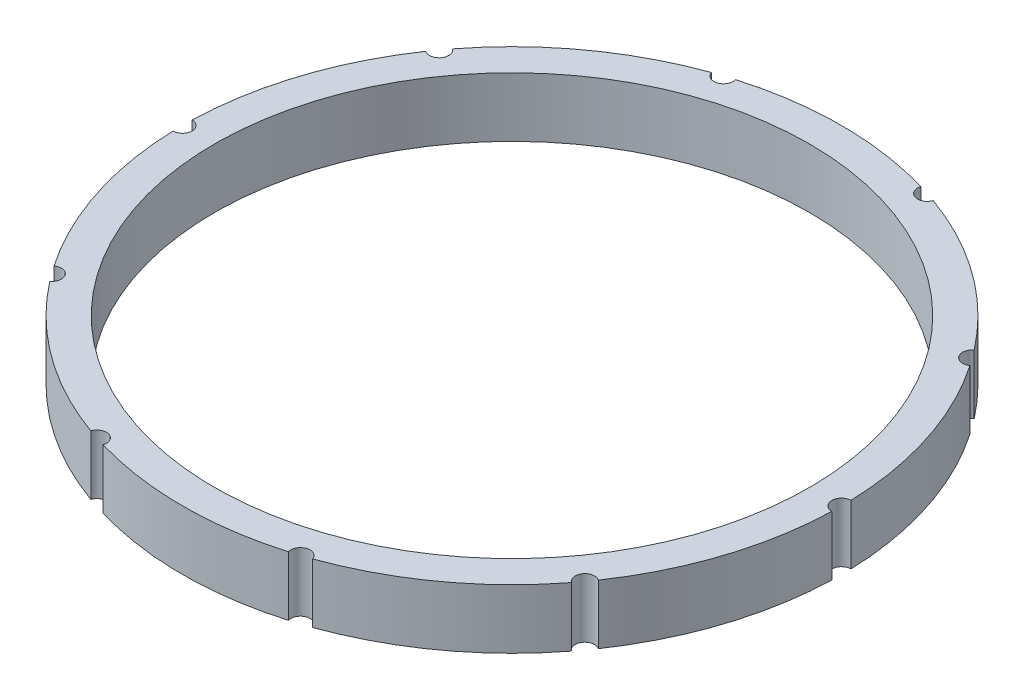
ISO-10303-21;
HEADER;
FILE_DESCRIPTION(('STEP AP214'),'2;1');
FILE_NAME('part.step','',(''),(''),'','','');
FILE_SCHEMA(('AUTOMOTIVE_DESIGN { 1 0 10303 214 1 1 1 1 }'));
ENDSEC;
DATA;
#1=APPLICATION_CONTEXT('core data for automotive mechanical design processes');
#2=APPLICATION_PROTOCOL_DEFINITION('international standard','automotive_design',2000,#1);
#3=PRODUCT_CONTEXT('',#1,'mechanical');
#4=PRODUCT('Part','Part','',(#3));
#5=PRODUCT_RELATED_PRODUCT_CATEGORY('part','',(#4));
#6=PRODUCT_DEFINITION_FORMATION('','',#4);
#7=PRODUCT_DEFINITION_CONTEXT('part definition',#1,'design');
#8=PRODUCT_DEFINITION('design','',#6,#7);
#9=PRODUCT_DEFINITION_SHAPE('','',#8);
#10=(LENGTH_UNIT() NAMED_UNIT(*) SI_UNIT(.MILLI.,.METRE.));
#11=(NAMED_UNIT(*) PLANE_ANGLE_UNIT() SI_UNIT($,.RADIAN.));
#12=(NAMED_UNIT(*) SI_UNIT($,.STERADIAN.) SOLID_ANGLE_UNIT());
#13=UNCERTAINTY_MEASURE_WITH_UNIT(LENGTH_MEASURE(1.E-05),#10,'distance_accuracy_value','');
#14=(GEOMETRIC_REPRESENTATION_CONTEXT(3) GLOBAL_UNCERTAINTY_ASSIGNED_CONTEXT((#13)) GLOBAL_UNIT_ASSIGNED_CONTEXT((#10,
#11,#12)) REPRESENTATION_CONTEXT('',''));
#15=CARTESIAN_POINT('',(0.,0.,0.));
#16=DIRECTION('',(0.,0.,1.));
#17=DIRECTION('',(1.,0.,0.));
#18=AXIS2_PLACEMENT_3D('',#15,#16,#17);
#19=CARTESIAN_POINT('',(0.,13.,0.));
#20=DIRECTION('',(0.,-1.,0.));
#21=DIRECTION('',(0.,0.,-1.));
#22=AXIS2_PLACEMENT_3D('',#19,#20,#21);
#23=CYLINDRICAL_SURFACE('',#22,72.1);
#24=CARTESIAN_POINT('',(0.,0.,0.));
#25=DIRECTION('',(0.,1.,0.));
#26=DIRECTION('',(0.,0.,1.));
#27=AXIS2_PLACEMENT_3D('',#24,#25,#26);
#28=CIRCLE('',#27,72.1);
#29=CARTESIAN_POINT('',(-24.2676816585499,0.,-67.8932222458124));
#30=VERTEX_POINT('',#29);
#31=CARTESIAN_POINT('',(-57.0711653825829,0.,-44.0600962535702));
#32=VERTEX_POINT('',#31);
#33=EDGE_CURVE('E234',#30,#32,#28,.T.);
#34=ORIENTED_EDGE('',*,*,#33,.T.);
#35=DIRECTION('',(0.,1.,0.));
#36=VECTOR('',#35,1.);
#37=CARTESIAN_POINT('',(-57.0711653825829,0.,-44.0600962535702));
#38=LINE('',#37,#36);
#39=CARTESIAN_POINT('',(-57.0711653825829,13.,-44.0600962535702));
#40=VERTEX_POINT('',#39);
#41=EDGE_CURVE('E274',#32,#40,#38,.T.);
#42=ORIENTED_EDGE('',*,*,#41,.T.);
#43=CARTESIAN_POINT('',(0.,13.,0.));
#44=DIRECTION('',(0.,1.,0.));
#45=DIRECTION('',(0.,0.,1.));
#46=AXIS2_PLACEMENT_3D('',#43,#44,#45);
#47=CIRCLE('',#46,72.1);
#48=CARTESIAN_POINT('',(-24.2676816585499,13.,-67.8932222458124));
#49=VERTEX_POINT('',#48);
#50=EDGE_CURVE('E359',#49,#40,#47,.T.);
#51=ORIENTED_EDGE('',*,*,#50,.F.);
#52=DIRECTION('',(0.,1.,0.));
#53=VECTOR('',#52,1.);
#54=CARTESIAN_POINT('',(-24.2676816585499,0.,-67.8932222458124));
#55=LINE('',#54,#53);
#56=EDGE_CURVE('E280',#30,#49,#55,.T.);
#57=ORIENTED_EDGE('',*,*,#56,.F.);
#58=EDGE_LOOP('',(#34,#42,#51,#57));
#59=FACE_BOUND('',#58,.T.);
#60=ADVANCED_FACE('F37',(#59),#23,.T.);
#61=CARTESIAN_POINT('',(20.2736678908558,0.,-69.1909559859617));
#62=VERTEX_POINT('',#61);
#63=CARTESIAN_POINT('',(-20.2736678908573,0.,-69.1909559859612));
#64=VERTEX_POINT('',#63);
#65=EDGE_CURVE('E228',#62,#64,#28,.T.);
#66=ORIENTED_EDGE('',*,*,#65,.T.);
#67=DIRECTION('',(0.,1.,0.));
#68=VECTOR('',#67,1.);
#69=CARTESIAN_POINT('',(-20.2736678908573,0.,-69.1909559859612));
#70=LINE('',#69,#68);
#71=CARTESIAN_POINT('',(-20.2736678908573,13.,-69.1909559859612));
#72=VERTEX_POINT('',#71);
#73=EDGE_CURVE('E282',#64,#72,#70,.T.);
#74=ORIENTED_EDGE('',*,*,#73,.T.);
#75=CARTESIAN_POINT('',(20.2736678908558,13.,-69.1909559859616));
#76=VERTEX_POINT('',#75);
#77=EDGE_CURVE('E355',#76,#72,#47,.T.);
#78=ORIENTED_EDGE('',*,*,#77,.F.);
#79=DIRECTION('',(0.,1.,0.));
#80=VECTOR('',#79,1.);
#81=CARTESIAN_POINT('',(20.2736678908558,0.,-69.1909559859616));
#82=LINE('',#81,#80);
#83=EDGE_CURVE('E287',#62,#76,#82,.T.);
#84=ORIENTED_EDGE('',*,*,#83,.F.);
#85=EDGE_LOOP('',(#66,#74,#78,#84));
#86=FACE_BOUND('',#85,.T.);
#87=ADVANCED_FACE('F379',(#86),#23,.T.);
#88=CARTESIAN_POINT('',(57.071165382582,0.,-44.0600962535714));
#89=VERTEX_POINT('',#88);
#90=CARTESIAN_POINT('',(24.2676816585485,0.,-67.8932222458129));
#91=VERTEX_POINT('',#90);
#92=EDGE_CURVE('E222',#89,#91,#28,.T.);
#93=ORIENTED_EDGE('',*,*,#92,.T.);
#94=DIRECTION('',(0.,1.,0.));
#95=VECTOR('',#94,1.);
#96=CARTESIAN_POINT('',(24.2676816585485,0.,-67.8932222458129));
#97=LINE('',#96,#95);
#98=CARTESIAN_POINT('',(24.2676816585485,13.,-67.8932222458129));
#99=VERTEX_POINT('',#98);
#100=EDGE_CURVE('E289',#91,#99,#97,.T.);
#101=ORIENTED_EDGE('',*,*,#100,.T.);
#102=CARTESIAN_POINT('',(57.071165382582,13.,-44.0600962535714));
#103=VERTEX_POINT('',#102);
#104=EDGE_CURVE('E351',#103,#99,#47,.T.);
#105=ORIENTED_EDGE('',*,*,#104,.F.);
#106=DIRECTION('',(0.,1.,0.));
#107=VECTOR('',#106,1.);
#108=CARTESIAN_POINT('',(57.071165382582,0.,-44.0600962535714));
#109=LINE('',#108,#107);
#110=EDGE_CURVE('E296',#89,#103,#109,.T.);
#111=ORIENTED_EDGE('',*,*,#110,.F.);
#112=EDGE_LOOP('',(#93,#101,#105,#111));
#113=FACE_BOUND('',#112,.T.);
#114=ADVANCED_FACE('F429',(#113),#23,.T.);
#115=CARTESIAN_POINT('',(72.0694174757281,0.,-2.09977729990818));
#116=VERTEX_POINT('',#115);
#117=CARTESIAN_POINT('',(59.5396016425511,0.,-40.6625852135145));
#118=VERTEX_POINT('',#117);
#119=EDGE_CURVE('E216',#116,#118,#28,.T.);
#120=ORIENTED_EDGE('',*,*,#119,.T.);
#121=DIRECTION('',(0.,1.,0.));
#122=VECTOR('',#121,1.);
#123=CARTESIAN_POINT('',(59.5396016425511,0.,-40.6625852135145));
#124=LINE('',#123,#122);
#125=CARTESIAN_POINT('',(59.5396016425511,13.,-40.6625852135145));
#126=VERTEX_POINT('',#125);
#127=EDGE_CURVE('E298',#118,#126,#124,.T.);
#128=ORIENTED_EDGE('',*,*,#127,.T.);
#129=CARTESIAN_POINT('',(72.0694174757281,13.,-2.09977729990818));
#130=VERTEX_POINT('',#129);
#131=EDGE_CURVE('E347',#130,#126,#47,.T.);
#132=ORIENTED_EDGE('',*,*,#131,.F.);
#133=DIRECTION('',(0.,1.,0.));
#134=VECTOR('',#133,1.);
#135=CARTESIAN_POINT('',(72.0694174757281,0.,-2.09977729990818));
#136=LINE('',#135,#134);
#137=EDGE_CURVE('E305',#116,#130,#136,.T.);
#138=ORIENTED_EDGE('',*,*,#137,.F.);
#139=EDGE_LOOP('',(#120,#128,#132,#138));
#140=FACE_BOUND('',#139,.T.);
#141=ADVANCED_FACE('F427',(#140),#23,.T.);
#142=CARTESIAN_POINT('',(59.5396016425517,0.,40.6625852135136));
#143=VERTEX_POINT('',#142);
#144=CARTESIAN_POINT('',(72.0694174757281,0.,2.09977729990818));
#145=VERTEX_POINT('',#144);
#146=EDGE_CURVE('E210',#143,#145,#28,.T.);
#147=ORIENTED_EDGE('',*,*,#146,.T.);
#148=DIRECTION('',(0.,1.,0.));
#149=VECTOR('',#148,1.);
#150=CARTESIAN_POINT('',(72.0694174757281,0.,2.09977729990818));
#151=LINE('',#150,#149);
#152=CARTESIAN_POINT('',(72.0694174757281,13.,2.09977729990818));
#153=VERTEX_POINT('',#152);
#154=EDGE_CURVE('E307',#145,#153,#151,.T.);
#155=ORIENTED_EDGE('',*,*,#154,.T.);
#156=CARTESIAN_POINT('',(59.5396016425517,13.,40.6625852135136));
#157=VERTEX_POINT('',#156);
#158=EDGE_CURVE('E343',#157,#153,#47,.T.);
#159=ORIENTED_EDGE('',*,*,#158,.F.);
#160=DIRECTION('',(0.,1.,0.));
#161=VECTOR('',#160,1.);
#162=CARTESIAN_POINT('',(59.5396016425517,0.,40.6625852135136));
#163=LINE('',#162,#161);
#164=EDGE_CURVE('E314',#143,#157,#163,.T.);
#165=ORIENTED_EDGE('',*,*,#164,.F.);
#166=EDGE_LOOP('',(#147,#155,#159,#165));
#167=FACE_BOUND('',#166,.T.);
#168=ADVANCED_FACE('F436',(#167),#23,.T.);
#169=CARTESIAN_POINT('',(24.2676816585494,0.,67.8932222458126));
#170=VERTEX_POINT('',#169);
#171=CARTESIAN_POINT('',(57.0711653825826,0.,44.0600962535706));
#172=VERTEX_POINT('',#171);
#173=EDGE_CURVE('E206',#170,#172,#28,.T.);
#174=ORIENTED_EDGE('',*,*,#173,.T.);
#175=DIRECTION('',(0.,1.,0.));
#176=VECTOR('',#175,1.);
#177=CARTESIAN_POINT('',(57.0711653825826,0.,44.0600962535706));
#178=LINE('',#177,#176);
#179=CARTESIAN_POINT('',(57.0711653825826,13.,44.0600962535706));
#180=VERTEX_POINT('',#179);
#181=EDGE_CURVE('E316',#172,#180,#178,.T.);
#182=ORIENTED_EDGE('',*,*,#181,.T.);
#183=CARTESIAN_POINT('',(24.2676816585494,13.,67.8932222458126));
#184=VERTEX_POINT('',#183);
#185=EDGE_CURVE('E341',#184,#180,#47,.T.);
#186=ORIENTED_EDGE('',*,*,#185,.F.);
#187=DIRECTION('',(0.,1.,0.));
#188=VECTOR('',#187,1.);
#189=CARTESIAN_POINT('',(24.2676816585494,0.,67.8932222458126));
#190=LINE('',#189,#188);
#191=EDGE_CURVE('E323',#170,#184,#190,.T.);
#192=ORIENTED_EDGE('',*,*,#191,.F.);
#193=EDGE_LOOP('',(#174,#182,#186,#192));
#194=FACE_BOUND('',#193,.T.);
#195=ADVANCED_FACE('F426',(#194),#23,.T.);
#196=CARTESIAN_POINT('',(-20.2736678908563,0.,69.1909559859615));
#197=VERTEX_POINT('',#196);
#198=CARTESIAN_POINT('',(20.2736678908568,0.,69.1909559859614));
#199=VERTEX_POINT('',#198);
#200=EDGE_CURVE('E199',#197,#199,#28,.T.);
#201=ORIENTED_EDGE('',*,*,#200,.T.);
#202=DIRECTION('',(0.,1.,0.));
#203=VECTOR('',#202,1.);
#204=CARTESIAN_POINT('',(20.2736678908568,0.,69.1909559859614));
#205=LINE('',#204,#203);
#206=CARTESIAN_POINT('',(20.2736678908568,13.,69.1909559859614));
#207=VERTEX_POINT('',#206);
#208=EDGE_CURVE('E325',#199,#207,#205,.T.);
#209=ORIENTED_EDGE('',*,*,#208,.T.);
#210=CARTESIAN_POINT('',(-20.2736678908563,13.,69.1909559859615));
#211=VERTEX_POINT('',#210);
#212=EDGE_CURVE('E338',#211,#207,#47,.T.);
#213=ORIENTED_EDGE('',*,*,#212,.F.);
#214=DIRECTION('',(0.,1.,0.));
#215=VECTOR('',#214,1.);
#216=CARTESIAN_POINT('',(-20.2736678908563,0.,69.1909559859615));
#217=LINE('',#216,#215);
#218=EDGE_CURVE('E187',#197,#211,#217,.T.);
#219=ORIENTED_EDGE('',*,*,#218,.F.);
#220=EDGE_LOOP('',(#201,#209,#213,#219));
#221=FACE_BOUND('',#220,.T.);
#222=ADVANCED_FACE('F340',(#221),#23,.T.);
#223=CARTESIAN_POINT('',(-57.0711653825823,0.,44.060096253571));
#224=VERTEX_POINT('',#223);
#225=CARTESIAN_POINT('',(-24.267681658549,0.,67.8932222458128));
#226=VERTEX_POINT('',#225);
#227=EDGE_CURVE('E196',#224,#226,#28,.T.);
#228=ORIENTED_EDGE('',*,*,#227,.T.);
#229=DIRECTION('',(0.,1.,0.));
#230=VECTOR('',#229,1.);
#231=CARTESIAN_POINT('',(-24.267681658549,0.,67.8932222458128));
#232=LINE('',#231,#230);
#233=CARTESIAN_POINT('',(-24.267681658549,13.,67.8932222458128));
#234=VERTEX_POINT('',#233);
#235=EDGE_CURVE('E175',#226,#234,#232,.T.);
#236=ORIENTED_EDGE('',*,*,#235,.T.);
#237=CARTESIAN_POINT('',(-57.0711653825823,13.,44.060096253571));
#238=VERTEX_POINT('',#237);
#239=EDGE_CURVE('E46',#238,#234,#47,.T.);
#240=ORIENTED_EDGE('',*,*,#239,.F.);
#241=DIRECTION('',(0.,1.,0.));
#242=VECTOR('',#241,1.);
#243=CARTESIAN_POINT('',(-57.0711653825823,0.,44.060096253571));
#244=LINE('',#243,#242);
#245=EDGE_CURVE('E203',#224,#238,#244,.T.);
#246=ORIENTED_EDGE('',*,*,#245,.F.);
#247=EDGE_LOOP('',(#228,#236,#240,#246));
#248=FACE_BOUND('',#247,.T.);
#249=ADVANCED_FACE('F202',(#248),#23,.T.);
#250=CARTESIAN_POINT('',(-72.0694174757281,0.,2.09977729990818));
#251=VERTEX_POINT('',#250);
#252=CARTESIAN_POINT('',(-59.5396016425514,0.,40.6625852135141));
#253=VERTEX_POINT('',#252);
#254=EDGE_CURVE('E41',#251,#253,#28,.T.);
#255=ORIENTED_EDGE('',*,*,#254,.T.);
#256=DIRECTION('',(0.,1.,0.));
#257=VECTOR('',#256,1.);
#258=CARTESIAN_POINT('',(-59.5396016425514,0.,40.6625852135141));
#259=LINE('',#258,#257);
#260=CARTESIAN_POINT('',(-59.5396016425514,13.,40.6625852135141));
#261=VERTEX_POINT('',#260);
#262=EDGE_CURVE('E263',#253,#261,#259,.T.);
#263=ORIENTED_EDGE('',*,*,#262,.T.);
#264=CARTESIAN_POINT('',(-72.0694174757281,13.,2.09977729990818));
#265=VERTEX_POINT('',#264);
#266=EDGE_CURVE('E11',#265,#261,#47,.T.);
#267=ORIENTED_EDGE('',*,*,#266,.F.);
#268=DIRECTION('',(0.,1.,0.));
#269=VECTOR('',#268,1.);
#270=CARTESIAN_POINT('',(-72.0694174757281,0.,2.09977729990818));
#271=LINE('',#270,#269);
#272=EDGE_CURVE('E256',#251,#265,#271,.T.);
#273=ORIENTED_EDGE('',*,*,#272,.F.);
#274=EDGE_LOOP('',(#255,#263,#267,#273));
#275=FACE_BOUND('',#274,.T.);
#276=ADVANCED_FACE('F372',(#275),#23,.T.);
#277=CARTESIAN_POINT('',(0.,13.,0.));
#278=DIRECTION('',(0.,1.,0.));
#279=DIRECTION('',(0.,0.,1.));
#280=AXIS2_PLACEMENT_3D('',#277,#278,#279);
#281=PLANE('',#280);
#282=CARTESIAN_POINT('',(-58.3301252944343,13.,-42.3793166902865));
#283=DIRECTION('',(0.,1.,0.));
#284=DIRECTION('',(-0.587785252292462,0.,0.809016994374955));
#285=AXIS2_PLACEMENT_3D('',#282,#283,#284);
#286=CIRCLE('',#285,2.1);
#287=CARTESIAN_POINT('',(-59.539601642552,13.,-40.6625852135132));
#288=VERTEX_POINT('',#287);
#289=EDGE_CURVE('E277',#288,#40,#286,.T.);
#290=ORIENTED_EDGE('',*,*,#289,.F.);
#291=CARTESIAN_POINT('',(-72.0694174757281,13.,-2.09977729990818));
#292=VERTEX_POINT('',#291);
#293=EDGE_CURVE('E47',#288,#292,#47,.T.);
#294=ORIENTED_EDGE('',*,*,#293,.T.);
#295=CARTESIAN_POINT('',(-72.1,13.,0.));
#296=DIRECTION('',(0.,1.,0.));
#297=DIRECTION('',(0.,0.,1.));
#298=AXIS2_PLACEMENT_3D('',#295,#296,#297);
#299=CIRCLE('',#298,2.1);
#300=EDGE_CURVE('E260',#265,#292,#299,.T.);
#301=ORIENTED_EDGE('',*,*,#300,.F.);
#302=ORIENTED_EDGE('',*,*,#266,.T.);
#303=CARTESIAN_POINT('',(-58.3301252944337,13.,42.3793166902874));
#304=DIRECTION('',(0.,1.,0.));
#305=DIRECTION('',(0.587785252292474,0.,0.809016994374947));
#306=AXIS2_PLACEMENT_3D('',#303,#304,#305);
#307=CIRCLE('',#306,2.1);
#308=EDGE_CURVE('E186',#238,#261,#307,.T.);
#309=ORIENTED_EDGE('',*,*,#308,.F.);
#310=ORIENTED_EDGE('',*,*,#239,.T.);
#311=CARTESIAN_POINT('',(-22.2801252944335,13.,68.5711748248806));
#312=DIRECTION('',(0.,1.,0.));
#313=DIRECTION('',(0.951056516295155,0.,0.309016994374945));
#314=AXIS2_PLACEMENT_3D('',#311,#312,#313);
#315=CIRCLE('',#314,2.1);
#316=EDGE_CURVE('E181',#211,#234,#315,.T.);
#317=ORIENTED_EDGE('',*,*,#316,.F.);
#318=ORIENTED_EDGE('',*,*,#212,.T.);
#319=CARTESIAN_POINT('',(22.280125294434,13.,68.5711748248805));
#320=DIRECTION('',(0.,1.,0.));
#321=DIRECTION('',(0.951056516295152,0.,-0.309016994374952));
#322=AXIS2_PLACEMENT_3D('',#319,#320,#321);
#323=CIRCLE('',#322,2.1);
#324=EDGE_CURVE('E319',#184,#207,#323,.T.);
#325=ORIENTED_EDGE('',*,*,#324,.F.);
#326=ORIENTED_EDGE('',*,*,#185,.T.);
#327=CARTESIAN_POINT('',(58.3301252944339,13.,42.379316690287));
#328=DIRECTION('',(0.,1.,0.));
#329=DIRECTION('',(0.587785252292469,0.,-0.809016994374951));
#330=AXIS2_PLACEMENT_3D('',#327,#328,#329);
#331=CIRCLE('',#330,2.1);
#332=EDGE_CURVE('E310',#157,#180,#331,.T.);
#333=ORIENTED_EDGE('',*,*,#332,.F.);
#334=ORIENTED_EDGE('',*,*,#158,.T.);
#335=CARTESIAN_POINT('',(72.1,13.,0.));
#336=DIRECTION('',(0.,1.,0.));
#337=DIRECTION('',(0.,0.,-1.));
#338=AXIS2_PLACEMENT_3D('',#335,#336,#337);
#339=CIRCLE('',#338,2.1);
#340=EDGE_CURVE('E301',#130,#153,#339,.T.);
#341=ORIENTED_EDGE('',*,*,#340,.F.);
#342=ORIENTED_EDGE('',*,*,#131,.T.);
#343=CARTESIAN_POINT('',(58.3301252944333,13.,-42.3793166902878));
#344=DIRECTION('',(0.,1.,0.));
#345=DIRECTION('',(-0.58778525229248,0.,-0.809016994374942));
#346=AXIS2_PLACEMENT_3D('',#343,#344,#345);
#347=CIRCLE('',#346,2.1);
#348=EDGE_CURVE('E292',#103,#126,#347,.T.);
#349=ORIENTED_EDGE('',*,*,#348,.F.);
#350=ORIENTED_EDGE('',*,*,#104,.T.);
#351=CARTESIAN_POINT('',(22.280125294433,13.,-68.5711748248808));
#352=DIRECTION('',(0.,1.,0.));
#353=DIRECTION('',(-0.951056516295157,0.,-0.309016994374938));
#354=AXIS2_PLACEMENT_3D('',#351,#352,#353);
#355=CIRCLE('',#354,2.1);
#356=EDGE_CURVE('E284',#76,#99,#355,.T.);
#357=ORIENTED_EDGE('',*,*,#356,.F.);
#358=ORIENTED_EDGE('',*,*,#77,.T.);
#359=CARTESIAN_POINT('',(-22.2801252944345,13.,-68.5711748248803));
#360=DIRECTION('',(0.,1.,0.));
#361=DIRECTION('',(-0.95105651629515,0.,0.309016994374958));
#362=AXIS2_PLACEMENT_3D('',#359,#360,#361);
#363=CIRCLE('',#362,2.1);
#364=EDGE_CURVE('E276',#49,#72,#363,.T.);
#365=ORIENTED_EDGE('',*,*,#364,.F.);
#366=ORIENTED_EDGE('',*,*,#50,.T.);
#367=EDGE_LOOP('',(#290,#294,#301,#302,#309,#310,#317,#318,#325,#326,#333,#334,#341,#342,#349,
#350,#357,#358,#365,#366));
#368=FACE_BOUND('',#367,.T.);
#369=CARTESIAN_POINT('',(0.,13.,0.));
#370=DIRECTION('',(0.,1.,0.));
#371=DIRECTION('',(0.,0.,1.));
#372=AXIS2_PLACEMENT_3D('',#369,#370,#371);
#373=CIRCLE('',#372,65.1);
#374=CARTESIAN_POINT('',(0.,13.,-65.1));
#375=VERTEX_POINT('',#374);
#376=EDGE_CURVE('E243',#375,#375,#373,.T.);
#377=ORIENTED_EDGE('',*,*,#376,.F.);
#378=EDGE_LOOP('',(#377));
#379=FACE_BOUND('',#378,.T.);
#380=ADVANCED_FACE('F335',(#368,#379),#281,.T.);
#381=CARTESIAN_POINT('',(0.,0.,0.));
#382=DIRECTION('',(0.,1.,0.));
#383=DIRECTION('',(0.,0.,1.));
#384=AXIS2_PLACEMENT_3D('',#381,#382,#383);
#385=PLANE('',#384);
#386=CARTESIAN_POINT('',(-59.539601642552,0.,-40.6625852135132));
#387=VERTEX_POINT('',#386);
#388=CARTESIAN_POINT('',(-72.0694174757281,0.,-2.09977729990818));
#389=VERTEX_POINT('',#388);
#390=EDGE_CURVE('E205',#387,#389,#28,.T.);
#391=ORIENTED_EDGE('',*,*,#390,.F.);
#392=CARTESIAN_POINT('',(-58.3301252944343,0.,-42.3793166902865));
#393=DIRECTION('',(0.,1.,0.));
#394=DIRECTION('',(-0.587785252292462,0.,0.809016994374955));
#395=AXIS2_PLACEMENT_3D('',#392,#393,#394);
#396=CIRCLE('',#395,2.1);
#397=EDGE_CURVE('E54',#387,#32,#396,.T.);
#398=ORIENTED_EDGE('',*,*,#397,.T.);
#399=ORIENTED_EDGE('',*,*,#33,.F.);
#400=CARTESIAN_POINT('',(-22.2801252944345,0.,-68.5711748248803));
#401=DIRECTION('',(0.,1.,0.));
#402=DIRECTION('',(-0.95105651629515,0.,0.309016994374958));
#403=AXIS2_PLACEMENT_3D('',#400,#401,#402);
#404=CIRCLE('',#403,2.1);
#405=EDGE_CURVE('E62',#30,#64,#404,.T.);
#406=ORIENTED_EDGE('',*,*,#405,.T.);
#407=ORIENTED_EDGE('',*,*,#65,.F.);
#408=CARTESIAN_POINT('',(22.280125294433,0.,-68.5711748248808));
#409=DIRECTION('',(0.,1.,0.));
#410=DIRECTION('',(-0.951056516295157,0.,-0.309016994374938));
#411=AXIS2_PLACEMENT_3D('',#408,#409,#410);
#412=CIRCLE('',#411,2.1);
#413=EDGE_CURVE('E290',#62,#91,#412,.T.);
#414=ORIENTED_EDGE('',*,*,#413,.T.);
#415=ORIENTED_EDGE('',*,*,#92,.F.);
#416=CARTESIAN_POINT('',(58.3301252944333,0.,-42.3793166902878));
#417=DIRECTION('',(0.,1.,0.));
#418=DIRECTION('',(-0.58778525229248,0.,-0.809016994374942));
#419=AXIS2_PLACEMENT_3D('',#416,#417,#418);
#420=CIRCLE('',#419,2.1);
#421=EDGE_CURVE('E299',#89,#118,#420,.T.);
#422=ORIENTED_EDGE('',*,*,#421,.T.);
#423=ORIENTED_EDGE('',*,*,#119,.F.);
#424=CARTESIAN_POINT('',(72.1,0.,0.));
#425=DIRECTION('',(0.,1.,0.));
#426=DIRECTION('',(0.,0.,-1.));
#427=AXIS2_PLACEMENT_3D('',#424,#425,#426);
#428=CIRCLE('',#427,2.1);
#429=EDGE_CURVE('E308',#116,#145,#428,.T.);
#430=ORIENTED_EDGE('',*,*,#429,.T.);
#431=ORIENTED_EDGE('',*,*,#146,.F.);
#432=CARTESIAN_POINT('',(58.3301252944339,0.,42.379316690287));
#433=DIRECTION('',(0.,1.,0.));
#434=DIRECTION('',(0.587785252292469,0.,-0.809016994374951));
#435=AXIS2_PLACEMENT_3D('',#432,#433,#434);
#436=CIRCLE('',#435,2.1);
#437=EDGE_CURVE('E317',#143,#172,#436,.T.);
#438=ORIENTED_EDGE('',*,*,#437,.T.);
#439=ORIENTED_EDGE('',*,*,#173,.F.);
#440=CARTESIAN_POINT('',(22.280125294434,0.,68.5711748248805));
#441=DIRECTION('',(0.,1.,0.));
#442=DIRECTION('',(0.951056516295152,0.,-0.309016994374952));
#443=AXIS2_PLACEMENT_3D('',#440,#441,#442);
#444=CIRCLE('',#443,2.1);
#445=EDGE_CURVE('E326',#170,#199,#444,.T.);
#446=ORIENTED_EDGE('',*,*,#445,.T.);
#447=ORIENTED_EDGE('',*,*,#200,.F.);
#448=CARTESIAN_POINT('',(-22.2801252944335,0.,68.5711748248806));
#449=DIRECTION('',(0.,1.,0.));
#450=DIRECTION('',(0.951056516295155,0.,0.309016994374945));
#451=AXIS2_PLACEMENT_3D('',#448,#449,#450);
#452=CIRCLE('',#451,2.1);
#453=EDGE_CURVE('E178',#197,#226,#452,.T.);
#454=ORIENTED_EDGE('',*,*,#453,.T.);
#455=ORIENTED_EDGE('',*,*,#227,.F.);
#456=CARTESIAN_POINT('',(-58.3301252944337,0.,42.3793166902874));
#457=DIRECTION('',(0.,1.,0.));
#458=DIRECTION('',(0.587785252292474,0.,0.809016994374947));
#459=AXIS2_PLACEMENT_3D('',#456,#457,#458);
#460=CIRCLE('',#459,2.1);
#461=EDGE_CURVE('E267',#224,#253,#460,.T.);
#462=ORIENTED_EDGE('',*,*,#461,.T.);
#463=ORIENTED_EDGE('',*,*,#254,.F.);
#464=CARTESIAN_POINT('',(-72.1,0.,0.));
#465=DIRECTION('',(0.,1.,0.));
#466=DIRECTION('',(0.,0.,1.));
#467=AXIS2_PLACEMENT_3D('',#464,#465,#466);
#468=CIRCLE('',#467,2.1);
#469=EDGE_CURVE('E258',#251,#389,#468,.T.);
#470=ORIENTED_EDGE('',*,*,#469,.T.);
#471=EDGE_LOOP('',(#391,#398,#399,#406,#407,#414,#415,#422,#423,#430,#431,#438,#439,#446,#447,
#454,#455,#462,#463,#470));
#472=FACE_BOUND('',#471,.T.);
#473=CARTESIAN_POINT('',(0.,0.,0.));
#474=DIRECTION('',(0.,1.,0.));
#475=DIRECTION('',(0.,0.,1.));
#476=AXIS2_PLACEMENT_3D('',#473,#474,#475);
#477=CIRCLE('',#476,65.1);
#478=CARTESIAN_POINT('',(0.,0.,-65.1));
#479=VERTEX_POINT('',#478);
#480=EDGE_CURVE('E248',#479,#479,#477,.T.);
#481=ORIENTED_EDGE('',*,*,#480,.T.);
#482=EDGE_LOOP('',(#481));
#483=FACE_BOUND('',#482,.T.);
#484=ADVANCED_FACE('F193',(#472,#483),#385,.F.);
#485=ORIENTED_EDGE('',*,*,#293,.F.);
#486=DIRECTION('',(0.,1.,0.));
#487=VECTOR('',#486,1.);
#488=CARTESIAN_POINT('',(-59.539601642552,0.,-40.6625852135132));
#489=LINE('',#488,#487);
#490=EDGE_CURVE('E272',#387,#288,#489,.T.);
#491=ORIENTED_EDGE('',*,*,#490,.F.);
#492=ORIENTED_EDGE('',*,*,#390,.T.);
#493=DIRECTION('',(0.,1.,0.));
#494=VECTOR('',#493,1.);
#495=CARTESIAN_POINT('',(-72.0694174757281,0.,-2.09977729990818));
#496=LINE('',#495,#494);
#497=EDGE_CURVE('E253',#389,#292,#496,.T.);
#498=ORIENTED_EDGE('',*,*,#497,.T.);
#499=EDGE_LOOP('',(#485,#491,#492,#498));
#500=FACE_BOUND('',#499,.T.);
#501=ADVANCED_FACE('F39',(#500),#23,.T.);
#502=CARTESIAN_POINT('',(0.,13.,0.));
#503=DIRECTION('',(0.,-1.,0.));
#504=DIRECTION('',(0.,0.,-1.));
#505=AXIS2_PLACEMENT_3D('',#502,#503,#504);
#506=CYLINDRICAL_SURFACE('',#505,65.1);
#507=CARTESIAN_POINT('',(0.,13.,-65.1));
#508=CARTESIAN_POINT('',(0.,12.8645833333333,-65.1));
#509=CARTESIAN_POINT('',(0.,12.7291666666667,-65.1));
#510=CARTESIAN_POINT('',(0.,12.4583333333333,-65.1));
#511=CARTESIAN_POINT('',(0.,12.3229166666667,-65.1));
#512=CARTESIAN_POINT('',(0.,12.0520833333333,-65.1));
#513=CARTESIAN_POINT('',(0.,11.9166666666667,-65.1));
#514=CARTESIAN_POINT('',(0.,11.6458333333333,-65.1));
#515=CARTESIAN_POINT('',(0.,11.5104166666667,-65.1));
#516=CARTESIAN_POINT('',(0.,11.2395833333333,-65.1));
#517=CARTESIAN_POINT('',(0.,11.1041666666667,-65.1));
#518=CARTESIAN_POINT('',(0.,10.8333333333333,-65.1));
#519=CARTESIAN_POINT('',(0.,10.6979166666667,-65.1));
#520=CARTESIAN_POINT('',(0.,10.4270833333333,-65.1));
#521=CARTESIAN_POINT('',(0.,10.2916666666667,-65.1));
#522=CARTESIAN_POINT('',(0.,10.0208333333333,-65.1));
#523=CARTESIAN_POINT('',(0.,9.88541666666667,-65.1));
#524=CARTESIAN_POINT('',(0.,9.61458333333333,-65.1));
#525=CARTESIAN_POINT('',(0.,9.47916666666667,-65.1));
#526=CARTESIAN_POINT('',(0.,9.20833333333333,-65.1));
#527=CARTESIAN_POINT('',(0.,9.07291666666667,-65.1));
#528=CARTESIAN_POINT('',(0.,8.80208333333333,-65.1));
#529=CARTESIAN_POINT('',(0.,8.66666666666667,-65.1));
#530=CARTESIAN_POINT('',(0.,8.39583333333333,-65.1));
#531=CARTESIAN_POINT('',(0.,8.26041666666667,-65.1));
#532=CARTESIAN_POINT('',(0.,7.98958333333333,-65.1));
#533=CARTESIAN_POINT('',(0.,7.85416666666667,-65.1));
#534=CARTESIAN_POINT('',(0.,7.58333333333333,-65.1));
#535=CARTESIAN_POINT('',(0.,7.44791666666667,-65.1));
#536=CARTESIAN_POINT('',(0.,7.17708333333333,-65.1));
#537=CARTESIAN_POINT('',(0.,7.04166666666667,-65.1));
#538=CARTESIAN_POINT('',(0.,6.77083333333333,-65.1));
#539=CARTESIAN_POINT('',(0.,6.63541666666667,-65.1));
#540=CARTESIAN_POINT('',(0.,6.36458333333333,-65.1));
#541=CARTESIAN_POINT('',(0.,6.22916666666667,-65.1));
#542=CARTESIAN_POINT('',(0.,5.95833333333333,-65.1));
#543=CARTESIAN_POINT('',(0.,5.82291666666667,-65.1));
#544=CARTESIAN_POINT('',(0.,5.55208333333333,-65.1));
#545=CARTESIAN_POINT('',(0.,5.41666666666667,-65.1));
#546=CARTESIAN_POINT('',(0.,5.14583333333333,-65.1));
#547=CARTESIAN_POINT('',(0.,5.01041666666667,-65.1));
#548=CARTESIAN_POINT('',(0.,4.73958333333333,-65.1));
#549=CARTESIAN_POINT('',(0.,4.60416666666667,-65.1));
#550=CARTESIAN_POINT('',(0.,4.33333333333333,-65.1));
#551=CARTESIAN_POINT('',(0.,4.19791666666667,-65.1));
#552=CARTESIAN_POINT('',(0.,3.92708333333333,-65.1));
#553=CARTESIAN_POINT('',(0.,3.79166666666667,-65.1));
#554=CARTESIAN_POINT('',(0.,3.52083333333333,-65.1));
#555=CARTESIAN_POINT('',(0.,3.38541666666667,-65.1));
#556=CARTESIAN_POINT('',(0.,3.11458333333333,-65.1));
#557=CARTESIAN_POINT('',(0.,2.97916666666667,-65.1));
#558=CARTESIAN_POINT('',(0.,2.70833333333333,-65.1));
#559=CARTESIAN_POINT('',(0.,2.57291666666667,-65.1));
#560=CARTESIAN_POINT('',(0.,2.30208333333333,-65.1));
#561=CARTESIAN_POINT('',(0.,2.16666666666667,-65.1));
#562=CARTESIAN_POINT('',(0.,1.89583333333333,-65.1));
#563=CARTESIAN_POINT('',(0.,1.76041666666667,-65.1));
#564=CARTESIAN_POINT('',(0.,1.48958333333333,-65.1));
#565=CARTESIAN_POINT('',(0.,1.35416666666667,-65.1));
#566=CARTESIAN_POINT('',(0.,1.08333333333333,-65.1));
#567=CARTESIAN_POINT('',(0.,0.947916666666667,-65.1));
#568=CARTESIAN_POINT('',(0.,0.677083333333334,-65.1));
#569=CARTESIAN_POINT('',(0.,0.541666666666667,-65.1));
#570=CARTESIAN_POINT('',(0.,0.270833333333334,-65.1));
#571=CARTESIAN_POINT('',(0.,0.135416666666667,-65.1));
#572=CARTESIAN_POINT('',(0.,0.,-65.1));
#573=B_SPLINE_CURVE_WITH_KNOTS('',3,(#507,#508,#509,#510,#511,#512,#513,#514,#515,#516,#517,
#518,#519,#520,#521,#522,#523,#524,#525,#526,#527,#528,#529,#530,#531,#532,#533,#534,#535,#536,
#537,#538,#539,#540,#541,#542,#543,#544,#545,#546,#547,#548,#549,#550,#551,#552,#553,#554,#555,
#556,#557,#558,#559,#560,#561,#562,#563,#564,#565,#566,#567,#568,#569,#570,#571,#572),
.UNSPECIFIED.,.F.,.F.,(4,2,2,2,2,2,2,2,2,2,2,2,2,2,2,2,2,2,2,2,2,2,2,2,2,2,2,2,2,2,2,2,4),(0.,
0.406249999999999,0.812499999999999,1.21875,1.625,2.03125,2.4375,2.84375,3.25,3.65625,4.0625,
4.46875,4.875,5.28125,5.6875,6.09375,6.5,6.90625,7.3125,7.71875,8.125,8.53125,8.9375,9.34375,
9.75,10.15625,10.5625,10.96875,11.375,11.78125,12.1875,12.59375,13.),.UNSPECIFIED.);
#574=EDGE_CURVE('BSEAM371',#375,#479,#573,.T.);
#575=ORIENTED_EDGE('',*,*,#376,.T.);
#576=ORIENTED_EDGE('',*,*,#480,.F.);
#577=ORIENTED_EDGE('',*,*,#574,.T.);
#578=ORIENTED_EDGE('',*,*,#574,.F.);
#579=EDGE_LOOP('',(#575,#577,#576,#578));
#580=FACE_BOUND('',#579,.T.);
#581=ADVANCED_FACE('F371',(#580),#506,.F.);
#582=CARTESIAN_POINT('',(-72.1,0.,0.));
#583=DIRECTION('',(0.,1.,0.));
#584=DIRECTION('',(0.,0.,1.));
#585=AXIS2_PLACEMENT_3D('',#582,#583,#584);
#586=CYLINDRICAL_SURFACE('',#585,2.1);
#587=ORIENTED_EDGE('',*,*,#300,.T.);
#588=ORIENTED_EDGE('',*,*,#497,.F.);
#589=ORIENTED_EDGE('',*,*,#469,.F.);
#590=ORIENTED_EDGE('',*,*,#272,.T.);
#591=EDGE_LOOP('',(#587,#588,#589,#590));
#592=FACE_BOUND('',#591,.T.);
#593=ADVANCED_FACE('F368',(#592),#586,.F.);
#594=CARTESIAN_POINT('',(-58.3301252944337,0.,42.3793166902874));
#595=DIRECTION('',(0.,1.,0.));
#596=DIRECTION('',(0.,0.,1.));
#597=AXIS2_PLACEMENT_3D('',#594,#595,#596);
#598=CYLINDRICAL_SURFACE('',#597,2.1);
#599=ORIENTED_EDGE('',*,*,#308,.T.);
#600=ORIENTED_EDGE('',*,*,#262,.F.);
#601=ORIENTED_EDGE('',*,*,#461,.F.);
#602=ORIENTED_EDGE('',*,*,#245,.T.);
#603=EDGE_LOOP('',(#599,#600,#601,#602));
#604=FACE_BOUND('',#603,.T.);
#605=ADVANCED_FACE('F389',(#604),#598,.F.);
#606=CARTESIAN_POINT('',(-22.2801252944335,0.,68.5711748248806));
#607=DIRECTION('',(0.,1.,0.));
#608=DIRECTION('',(0.,0.,1.));
#609=AXIS2_PLACEMENT_3D('',#606,#607,#608);
#610=CYLINDRICAL_SURFACE('',#609,2.1);
#611=ORIENTED_EDGE('',*,*,#316,.T.);
#612=ORIENTED_EDGE('',*,*,#235,.F.);
#613=ORIENTED_EDGE('',*,*,#453,.F.);
#614=ORIENTED_EDGE('',*,*,#218,.T.);
#615=EDGE_LOOP('',(#611,#612,#613,#614));
#616=FACE_BOUND('',#615,.T.);
#617=ADVANCED_FACE('F177',(#616),#610,.F.);
#618=CARTESIAN_POINT('',(22.280125294434,0.,68.5711748248805));
#619=DIRECTION('',(0.,1.,0.));
#620=DIRECTION('',(0.,0.,1.));
#621=AXIS2_PLACEMENT_3D('',#618,#619,#620);
#622=CYLINDRICAL_SURFACE('',#621,2.1);
#623=ORIENTED_EDGE('',*,*,#324,.T.);
#624=ORIENTED_EDGE('',*,*,#208,.F.);
#625=ORIENTED_EDGE('',*,*,#445,.F.);
#626=ORIENTED_EDGE('',*,*,#191,.T.);
#627=EDGE_LOOP('',(#623,#624,#625,#626));
#628=FACE_BOUND('',#627,.T.);
#629=ADVANCED_FACE('F396',(#628),#622,.F.);
#630=CARTESIAN_POINT('',(58.3301252944339,0.,42.379316690287));
#631=DIRECTION('',(0.,1.,0.));
#632=DIRECTION('',(0.,0.,1.));
#633=AXIS2_PLACEMENT_3D('',#630,#631,#632);
#634=CYLINDRICAL_SURFACE('',#633,2.1);
#635=ORIENTED_EDGE('',*,*,#332,.T.);
#636=ORIENTED_EDGE('',*,*,#181,.F.);
#637=ORIENTED_EDGE('',*,*,#437,.F.);
#638=ORIENTED_EDGE('',*,*,#164,.T.);
#639=EDGE_LOOP('',(#635,#636,#637,#638));
#640=FACE_BOUND('',#639,.T.);
#641=ADVANCED_FACE('F417',(#640),#634,.F.);
#642=CARTESIAN_POINT('',(72.1,0.,0.));
#643=DIRECTION('',(0.,1.,0.));
#644=DIRECTION('',(0.,0.,1.));
#645=AXIS2_PLACEMENT_3D('',#642,#643,#644);
#646=CYLINDRICAL_SURFACE('',#645,2.1);
#647=ORIENTED_EDGE('',*,*,#340,.T.);
#648=ORIENTED_EDGE('',*,*,#154,.F.);
#649=ORIENTED_EDGE('',*,*,#429,.F.);
#650=ORIENTED_EDGE('',*,*,#137,.T.);
#651=EDGE_LOOP('',(#647,#648,#649,#650));
#652=FACE_BOUND('',#651,.T.);
#653=ADVANCED_FACE('F413',(#652),#646,.F.);
#654=CARTESIAN_POINT('',(58.3301252944333,0.,-42.3793166902878));
#655=DIRECTION('',(0.,1.,0.));
#656=DIRECTION('',(0.,0.,1.));
#657=AXIS2_PLACEMENT_3D('',#654,#655,#656);
#658=CYLINDRICAL_SURFACE('',#657,2.1);
#659=ORIENTED_EDGE('',*,*,#348,.T.);
#660=ORIENTED_EDGE('',*,*,#127,.F.);
#661=ORIENTED_EDGE('',*,*,#421,.F.);
#662=ORIENTED_EDGE('',*,*,#110,.T.);
#663=EDGE_LOOP('',(#659,#660,#661,#662));
#664=FACE_BOUND('',#663,.T.);
#665=ADVANCED_FACE('F409',(#664),#658,.F.);
#666=CARTESIAN_POINT('',(22.280125294433,0.,-68.5711748248808));
#667=DIRECTION('',(0.,1.,0.));
#668=DIRECTION('',(0.,0.,1.));
#669=AXIS2_PLACEMENT_3D('',#666,#667,#668);
#670=CYLINDRICAL_SURFACE('',#669,2.1);
#671=ORIENTED_EDGE('',*,*,#356,.T.);
#672=ORIENTED_EDGE('',*,*,#100,.F.);
#673=ORIENTED_EDGE('',*,*,#413,.F.);
#674=ORIENTED_EDGE('',*,*,#83,.T.);
#675=EDGE_LOOP('',(#671,#672,#673,#674));
#676=FACE_BOUND('',#675,.T.);
#677=ADVANCED_FACE('F406',(#676),#670,.F.);
#678=CARTESIAN_POINT('',(-22.2801252944345,0.,-68.5711748248803));
#679=DIRECTION('',(0.,1.,0.));
#680=DIRECTION('',(0.,0.,1.));
#681=AXIS2_PLACEMENT_3D('',#678,#679,#680);
#682=CYLINDRICAL_SURFACE('',#681,2.1);
#683=ORIENTED_EDGE('',*,*,#364,.T.);
#684=ORIENTED_EDGE('',*,*,#73,.F.);
#685=ORIENTED_EDGE('',*,*,#405,.F.);
#686=ORIENTED_EDGE('',*,*,#56,.T.);
#687=EDGE_LOOP('',(#683,#684,#685,#686));
#688=FACE_BOUND('',#687,.T.);
#689=ADVANCED_FACE('F403',(#688),#682,.F.);
#690=CARTESIAN_POINT('',(-58.3301252944343,0.,-42.3793166902865));
#691=DIRECTION('',(0.,1.,0.));
#692=DIRECTION('',(0.,0.,1.));
#693=AXIS2_PLACEMENT_3D('',#690,#691,#692);
#694=CYLINDRICAL_SURFACE('',#693,2.1);
#695=ORIENTED_EDGE('',*,*,#289,.T.);
#696=ORIENTED_EDGE('',*,*,#41,.F.);
#697=ORIENTED_EDGE('',*,*,#397,.F.);
#698=ORIENTED_EDGE('',*,*,#490,.T.);
#699=EDGE_LOOP('',(#695,#696,#697,#698));
#700=FACE_BOUND('',#699,.T.);
#701=ADVANCED_FACE('F400',(#700),#694,.F.);
#702=CLOSED_SHELL('',(#60,#87,#114,#141,#168,#195,#222,#249,#276,#380,#484,#501,#581,#593,#605,
#617,#629,#641,#653,#665,#677,#689,#701));
#703=MANIFOLD_SOLID_BREP('B2',#702);
#704=ADVANCED_BREP_SHAPE_REPRESENTATION('',(#18,#703),#14);
#705=SHAPE_DEFINITION_REPRESENTATION(#9,#704);
ENDSEC;
END-ISO-10303-21;
